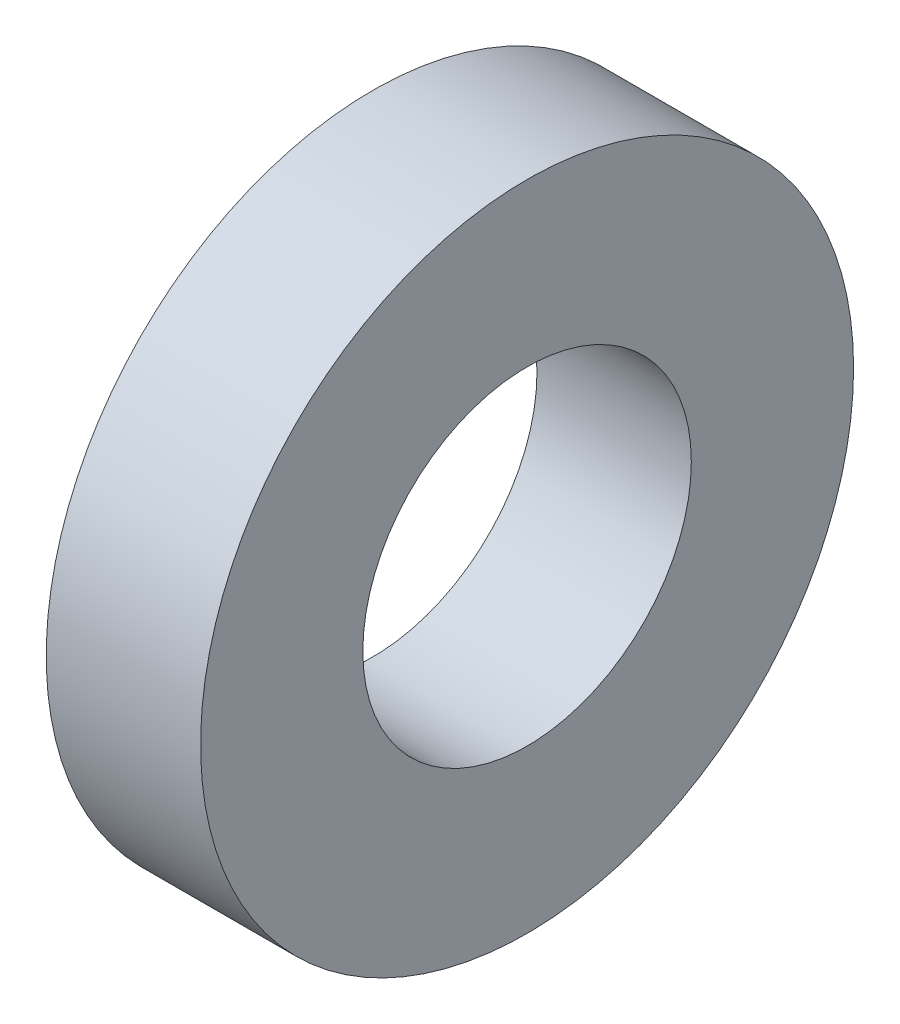
ISO-10303-21;
HEADER;
FILE_DESCRIPTION(('STEP AP214'),'2;1');
FILE_NAME('part.step','',(''),(''),'','','');
FILE_SCHEMA(('AUTOMOTIVE_DESIGN { 1 0 10303 214 1 1 1 1 }'));
ENDSEC;
DATA;
#1=APPLICATION_CONTEXT('core data for automotive mechanical design processes');
#2=APPLICATION_PROTOCOL_DEFINITION('international standard','automotive_design',2000,#1);
#3=PRODUCT_CONTEXT('',#1,'mechanical');
#4=PRODUCT('Part','Part','',(#3));
#5=PRODUCT_RELATED_PRODUCT_CATEGORY('part','',(#4));
#6=PRODUCT_DEFINITION_FORMATION('','',#4);
#7=PRODUCT_DEFINITION_CONTEXT('part definition',#1,'design');
#8=PRODUCT_DEFINITION('design','',#6,#7);
#9=PRODUCT_DEFINITION_SHAPE('','',#8);
#10=(LENGTH_UNIT() NAMED_UNIT(*) SI_UNIT(.MILLI.,.METRE.));
#11=(NAMED_UNIT(*) PLANE_ANGLE_UNIT() SI_UNIT($,.RADIAN.));
#12=(NAMED_UNIT(*) SI_UNIT($,.STERADIAN.) SOLID_ANGLE_UNIT());
#13=UNCERTAINTY_MEASURE_WITH_UNIT(LENGTH_MEASURE(1.E-05),#10,'distance_accuracy_value','');
#14=(GEOMETRIC_REPRESENTATION_CONTEXT(3) GLOBAL_UNCERTAINTY_ASSIGNED_CONTEXT((#13)) GLOBAL_UNIT_ASSIGNED_CONTEXT((#10,
#11,#12)) REPRESENTATION_CONTEXT('',''));
#15=CARTESIAN_POINT('',(0.,0.,0.));
#16=DIRECTION('',(0.,0.,1.));
#17=DIRECTION('',(1.,0.,0.));
#18=AXIS2_PLACEMENT_3D('',#15,#16,#17);
#19=CARTESIAN_POINT('',(3.9,0.,0.));
#20=DIRECTION('',(1.,0.,0.));
#21=DIRECTION('',(0.,0.,-1.));
#22=AXIS2_PLACEMENT_3D('',#19,#20,#21);
#23=PLANE('',#22);
#24=CARTESIAN_POINT('',(3.9,0.,0.));
#25=DIRECTION('',(1.,0.,0.));
#26=DIRECTION('',(0.,0.,-1.));
#27=AXIS2_PLACEMENT_3D('',#24,#25,#26);
#28=CIRCLE('',#27,8.25);
#29=CARTESIAN_POINT('',(3.9,0.,-8.25));
#30=VERTEX_POINT('',#29);
#31=EDGE_CURVE('E10',#30,#30,#28,.T.);
#32=ORIENTED_EDGE('',*,*,#31,.T.);
#33=EDGE_LOOP('',(#32));
#34=FACE_BOUND('',#33,.T.);
#35=CARTESIAN_POINT('',(3.9,0.,0.));
#36=DIRECTION('',(1.,0.,0.));
#37=DIRECTION('',(0.,0.,-1.));
#38=AXIS2_PLACEMENT_3D('',#35,#36,#37);
#39=CIRCLE('',#38,4.15);
#40=CARTESIAN_POINT('',(3.9,0.,-4.15));
#41=VERTEX_POINT('',#40);
#42=EDGE_CURVE('E52',#41,#41,#39,.T.);
#43=ORIENTED_EDGE('',*,*,#42,.F.);
#44=EDGE_LOOP('',(#43));
#45=FACE_BOUND('',#44,.T.);
#46=ADVANCED_FACE('F41',(#34,#45),#23,.T.);
#47=CARTESIAN_POINT('',(0.,0.,0.));
#48=DIRECTION('',(1.,0.,0.));
#49=DIRECTION('',(0.,0.,-1.));
#50=AXIS2_PLACEMENT_3D('',#47,#48,#49);
#51=PLANE('',#50);
#52=CARTESIAN_POINT('',(0.,0.,0.));
#53=DIRECTION('',(1.,0.,0.));
#54=DIRECTION('',(0.,0.,-1.));
#55=AXIS2_PLACEMENT_3D('',#52,#53,#54);
#56=CIRCLE('',#55,8.25);
#57=CARTESIAN_POINT('',(0.,0.,-8.25));
#58=VERTEX_POINT('',#57);
#59=EDGE_CURVE('E45',#58,#58,#56,.T.);
#60=ORIENTED_EDGE('',*,*,#59,.F.);
#61=EDGE_LOOP('',(#60));
#62=FACE_BOUND('',#61,.T.);
#63=CARTESIAN_POINT('',(0.,0.,0.));
#64=DIRECTION('',(1.,0.,0.));
#65=DIRECTION('',(0.,0.,-1.));
#66=AXIS2_PLACEMENT_3D('',#63,#64,#65);
#67=CIRCLE('',#66,4.15);
#68=CARTESIAN_POINT('',(0.,0.,-4.15));
#69=VERTEX_POINT('',#68);
#70=EDGE_CURVE('E54',#69,#69,#67,.T.);
#71=ORIENTED_EDGE('',*,*,#70,.T.);
#72=EDGE_LOOP('',(#71));
#73=FACE_BOUND('',#72,.T.);
#74=ADVANCED_FACE('F64',(#62,#73),#51,.F.);
#75=CARTESIAN_POINT('',(3.9,0.,0.));
#76=DIRECTION('',(-1.,0.,0.));
#77=DIRECTION('',(0.,0.,1.));
#78=AXIS2_PLACEMENT_3D('',#75,#76,#77);
#79=CYLINDRICAL_SURFACE('',#78,8.25);
#80=ORIENTED_EDGE('',*,*,#31,.F.);
#81=EDGE_LOOP('',(#80));
#82=FACE_BOUND('',#81,.T.);
#83=ORIENTED_EDGE('',*,*,#59,.T.);
#84=EDGE_LOOP('',(#83));
#85=FACE_BOUND('',#84,.T.);
#86=ADVANCED_FACE('F43',(#82,#85),#79,.T.);
#87=CARTESIAN_POINT('',(3.9,0.,0.));
#88=DIRECTION('',(-1.,0.,0.));
#89=DIRECTION('',(0.,0.,1.));
#90=AXIS2_PLACEMENT_3D('',#87,#88,#89);
#91=CYLINDRICAL_SURFACE('',#90,4.15);
#92=ORIENTED_EDGE('',*,*,#42,.T.);
#93=EDGE_LOOP('',(#92));
#94=FACE_BOUND('',#93,.T.);
#95=ORIENTED_EDGE('',*,*,#70,.F.);
#96=EDGE_LOOP('',(#95));
#97=FACE_BOUND('',#96,.T.);
#98=ADVANCED_FACE('F60',(#94,#97),#91,.F.);
#99=CLOSED_SHELL('',(#46,#74,#86,#98));
#100=MANIFOLD_SOLID_BREP('B2',#99);
#101=ADVANCED_BREP_SHAPE_REPRESENTATION('',(#18,#100),#14);
#102=SHAPE_DEFINITION_REPRESENTATION(#9,#101);
ENDSEC;
END-ISO-10303-21;
